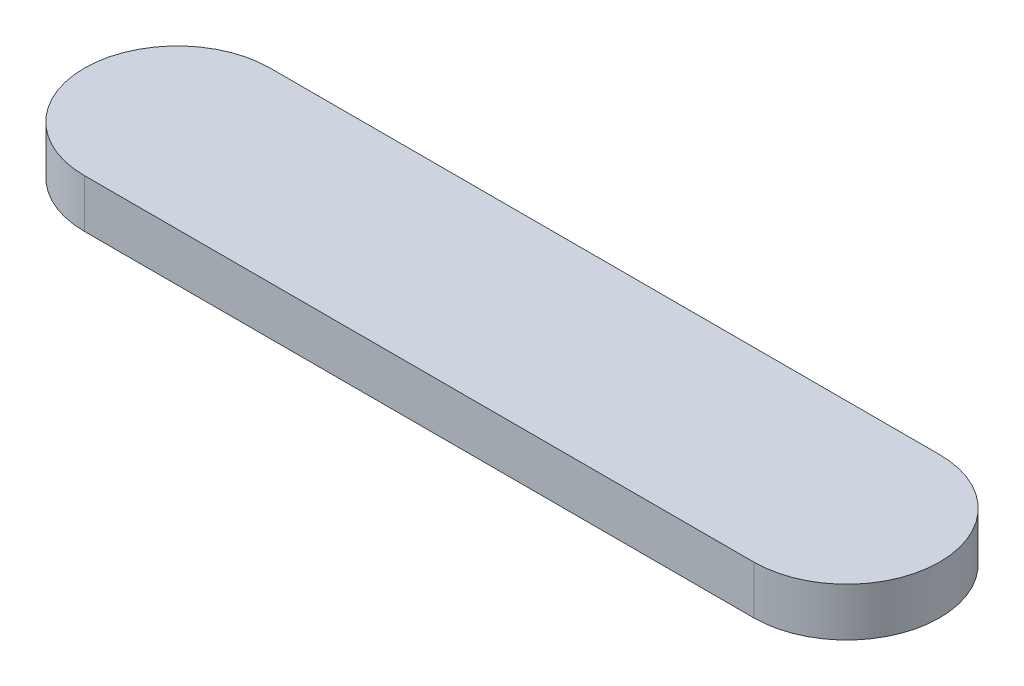
ISO-10303-21;
HEADER;
FILE_DESCRIPTION(('STEP AP214'),'2;1');
FILE_NAME('part.step','',(''),(''),'','','');
FILE_SCHEMA(('AUTOMOTIVE_DESIGN { 1 0 10303 214 1 1 1 1 }'));
ENDSEC;
DATA;
#1=APPLICATION_CONTEXT('core data for automotive mechanical design processes');
#2=APPLICATION_PROTOCOL_DEFINITION('international standard','automotive_design',2000,#1);
#3=PRODUCT_CONTEXT('',#1,'mechanical');
#4=PRODUCT('Part','Part','',(#3));
#5=PRODUCT_RELATED_PRODUCT_CATEGORY('part','',(#4));
#6=PRODUCT_DEFINITION_FORMATION('','',#4);
#7=PRODUCT_DEFINITION_CONTEXT('part definition',#1,'design');
#8=PRODUCT_DEFINITION('design','',#6,#7);
#9=PRODUCT_DEFINITION_SHAPE('','',#8);
#10=(LENGTH_UNIT() NAMED_UNIT(*) SI_UNIT(.MILLI.,.METRE.));
#11=(NAMED_UNIT(*) PLANE_ANGLE_UNIT() SI_UNIT($,.RADIAN.));
#12=(NAMED_UNIT(*) SI_UNIT($,.STERADIAN.) SOLID_ANGLE_UNIT());
#13=UNCERTAINTY_MEASURE_WITH_UNIT(LENGTH_MEASURE(1.E-05),#10,'distance_accuracy_value','');
#14=(GEOMETRIC_REPRESENTATION_CONTEXT(3) GLOBAL_UNCERTAINTY_ASSIGNED_CONTEXT((#13)) GLOBAL_UNIT_ASSIGNED_CONTEXT((#10,
#11,#12)) REPRESENTATION_CONTEXT('',''));
#15=CARTESIAN_POINT('',(0.,0.,0.));
#16=DIRECTION('',(0.,0.,1.));
#17=DIRECTION('',(1.,0.,0.));
#18=AXIS2_PLACEMENT_3D('',#15,#16,#17);
#19=CARTESIAN_POINT('',(0.,13.,0.));
#20=DIRECTION('',(0.,-1.,0.));
#21=DIRECTION('',(0.,0.,-1.));
#22=AXIS2_PLACEMENT_3D('',#19,#20,#21);
#23=CYLINDRICAL_SURFACE('',#22,25.);
#24=CARTESIAN_POINT('',(0.,0.,0.));
#25=DIRECTION('',(0.,1.,0.));
#26=DIRECTION('',(0.,0.,1.));
#27=AXIS2_PLACEMENT_3D('',#24,#25,#26);
#28=CIRCLE('',#27,25.);
#29=CARTESIAN_POINT('',(0.,0.,-25.));
#30=VERTEX_POINT('',#29);
#31=CARTESIAN_POINT('',(0.,0.,25.));
#32=VERTEX_POINT('',#31);
#33=EDGE_CURVE('E100',#30,#32,#28,.T.);
#34=ORIENTED_EDGE('',*,*,#33,.T.);
#35=DIRECTION('',(0.,-1.,0.));
#36=VECTOR('',#35,1.);
#37=CARTESIAN_POINT('',(0.,13.,25.));
#38=LINE('',#37,#36);
#39=CARTESIAN_POINT('',(0.,13.,25.));
#40=VERTEX_POINT('',#39);
#41=EDGE_CURVE('E11',#40,#32,#38,.T.);
#42=ORIENTED_EDGE('',*,*,#41,.F.);
#43=CARTESIAN_POINT('',(0.,13.,0.));
#44=DIRECTION('',(0.,1.,0.));
#45=DIRECTION('',(0.,0.,1.));
#46=AXIS2_PLACEMENT_3D('',#43,#44,#45);
#47=CIRCLE('',#46,25.);
#48=CARTESIAN_POINT('',(0.,13.,-25.));
#49=VERTEX_POINT('',#48);
#50=EDGE_CURVE('E88',#49,#40,#47,.T.);
#51=ORIENTED_EDGE('',*,*,#50,.F.);
#52=DIRECTION('',(0.,-1.,0.));
#53=VECTOR('',#52,1.);
#54=CARTESIAN_POINT('',(0.,13.,-25.));
#55=LINE('',#54,#53);
#56=EDGE_CURVE('E96',#49,#30,#55,.T.);
#57=ORIENTED_EDGE('',*,*,#56,.T.);
#58=EDGE_LOOP('',(#34,#42,#51,#57));
#59=FACE_BOUND('',#58,.T.);
#60=ADVANCED_FACE('F37',(#59),#23,.T.);
#61=CARTESIAN_POINT('',(0.,13.,25.));
#62=DIRECTION('',(0.,0.,-1.));
#63=DIRECTION('',(-1.,0.,0.));
#64=AXIS2_PLACEMENT_3D('',#61,#62,#63);
#65=PLANE('',#64);
#66=DIRECTION('',(1.,0.,0.));
#67=VECTOR('',#66,1.);
#68=CARTESIAN_POINT('',(0.,0.,25.));
#69=LINE('',#68,#67);
#70=CARTESIAN_POINT('',(180.,0.,25.));
#71=VERTEX_POINT('',#70);
#72=EDGE_CURVE('E92',#32,#71,#69,.T.);
#73=ORIENTED_EDGE('',*,*,#72,.T.);
#74=DIRECTION('',(0.,-1.,0.));
#75=VECTOR('',#74,1.);
#76=CARTESIAN_POINT('',(180.,13.,25.));
#77=LINE('',#76,#75);
#78=CARTESIAN_POINT('',(180.,13.,25.));
#79=VERTEX_POINT('',#78);
#80=EDGE_CURVE('E45',#79,#71,#77,.T.);
#81=ORIENTED_EDGE('',*,*,#80,.F.);
#82=DIRECTION('',(1.,0.,0.));
#83=VECTOR('',#82,1.);
#84=CARTESIAN_POINT('',(0.,13.,25.));
#85=LINE('',#84,#83);
#86=EDGE_CURVE('E83',#40,#79,#85,.T.);
#87=ORIENTED_EDGE('',*,*,#86,.F.);
#88=ORIENTED_EDGE('',*,*,#41,.T.);
#89=EDGE_LOOP('',(#73,#81,#87,#88));
#90=FACE_BOUND('',#89,.T.);
#91=ADVANCED_FACE('F91',(#90),#65,.F.);
#92=CARTESIAN_POINT('',(180.,13.,0.));
#93=DIRECTION('',(0.,-1.,0.));
#94=DIRECTION('',(0.,0.,-1.));
#95=AXIS2_PLACEMENT_3D('',#92,#93,#94);
#96=CYLINDRICAL_SURFACE('',#95,25.);
#97=CARTESIAN_POINT('',(180.,0.,0.));
#98=DIRECTION('',(0.,1.,0.));
#99=DIRECTION('',(0.,0.,1.));
#100=AXIS2_PLACEMENT_3D('',#97,#98,#99);
#101=CIRCLE('',#100,25.);
#102=CARTESIAN_POINT('',(180.,0.,-25.));
#103=VERTEX_POINT('',#102);
#104=EDGE_CURVE('E70',#71,#103,#101,.T.);
#105=ORIENTED_EDGE('',*,*,#104,.T.);
#106=DIRECTION('',(0.,-1.,0.));
#107=VECTOR('',#106,1.);
#108=CARTESIAN_POINT('',(180.,13.,-25.));
#109=LINE('',#108,#107);
#110=CARTESIAN_POINT('',(180.,13.,-25.));
#111=VERTEX_POINT('',#110);
#112=EDGE_CURVE('E93',#111,#103,#109,.T.);
#113=ORIENTED_EDGE('',*,*,#112,.F.);
#114=CARTESIAN_POINT('',(180.,13.,0.));
#115=DIRECTION('',(0.,1.,0.));
#116=DIRECTION('',(0.,0.,1.));
#117=AXIS2_PLACEMENT_3D('',#114,#115,#116);
#118=CIRCLE('',#117,25.);
#119=EDGE_CURVE('E86',#79,#111,#118,.T.);
#120=ORIENTED_EDGE('',*,*,#119,.F.);
#121=ORIENTED_EDGE('',*,*,#80,.T.);
#122=EDGE_LOOP('',(#105,#113,#120,#121));
#123=FACE_BOUND('',#122,.T.);
#124=ADVANCED_FACE('F94',(#123),#96,.T.);
#125=CARTESIAN_POINT('',(0.,13.,-25.));
#126=DIRECTION('',(0.,0.,1.));
#127=DIRECTION('',(1.,0.,0.));
#128=AXIS2_PLACEMENT_3D('',#125,#126,#127);
#129=PLANE('',#128);
#130=DIRECTION('',(-1.,0.,0.));
#131=VECTOR('',#130,1.);
#132=CARTESIAN_POINT('',(0.,0.,-25.));
#133=LINE('',#132,#131);
#134=EDGE_CURVE('E76',#103,#30,#133,.T.);
#135=ORIENTED_EDGE('',*,*,#134,.T.);
#136=ORIENTED_EDGE('',*,*,#56,.F.);
#137=DIRECTION('',(-1.,0.,0.));
#138=VECTOR('',#137,1.);
#139=CARTESIAN_POINT('',(0.,13.,-25.));
#140=LINE('',#139,#138);
#141=EDGE_CURVE('E53',#111,#49,#140,.T.);
#142=ORIENTED_EDGE('',*,*,#141,.F.);
#143=ORIENTED_EDGE('',*,*,#112,.T.);
#144=EDGE_LOOP('',(#135,#136,#142,#143));
#145=FACE_BOUND('',#144,.T.);
#146=ADVANCED_FACE('F107',(#145),#129,.F.);
#147=CARTESIAN_POINT('',(0.,13.,0.));
#148=DIRECTION('',(0.,1.,0.));
#149=DIRECTION('',(0.,0.,1.));
#150=AXIS2_PLACEMENT_3D('',#147,#148,#149);
#151=PLANE('',#150);
#152=ORIENTED_EDGE('',*,*,#50,.T.);
#153=ORIENTED_EDGE('',*,*,#86,.T.);
#154=ORIENTED_EDGE('',*,*,#119,.T.);
#155=ORIENTED_EDGE('',*,*,#141,.T.);
#156=EDGE_LOOP('',(#152,#153,#154,#155));
#157=FACE_BOUND('',#156,.T.);
#158=ADVANCED_FACE('F84',(#157),#151,.T.);
#159=CARTESIAN_POINT('',(0.,0.,0.));
#160=DIRECTION('',(0.,1.,0.));
#161=DIRECTION('',(0.,0.,1.));
#162=AXIS2_PLACEMENT_3D('',#159,#160,#161);
#163=PLANE('',#162);
#164=ORIENTED_EDGE('',*,*,#33,.F.);
#165=ORIENTED_EDGE('',*,*,#134,.F.);
#166=ORIENTED_EDGE('',*,*,#104,.F.);
#167=ORIENTED_EDGE('',*,*,#72,.F.);
#168=EDGE_LOOP('',(#164,#165,#166,#167));
#169=FACE_BOUND('',#168,.T.);
#170=ADVANCED_FACE('F110',(#169),#163,.F.);
#171=CLOSED_SHELL('',(#60,#91,#124,#146,#158,#170));
#172=MANIFOLD_SOLID_BREP('B2',#171);
#173=ADVANCED_BREP_SHAPE_REPRESENTATION('',(#18,#172),#14);
#174=SHAPE_DEFINITION_REPRESENTATION(#9,#173);
ENDSEC;
END-ISO-10303-21;
